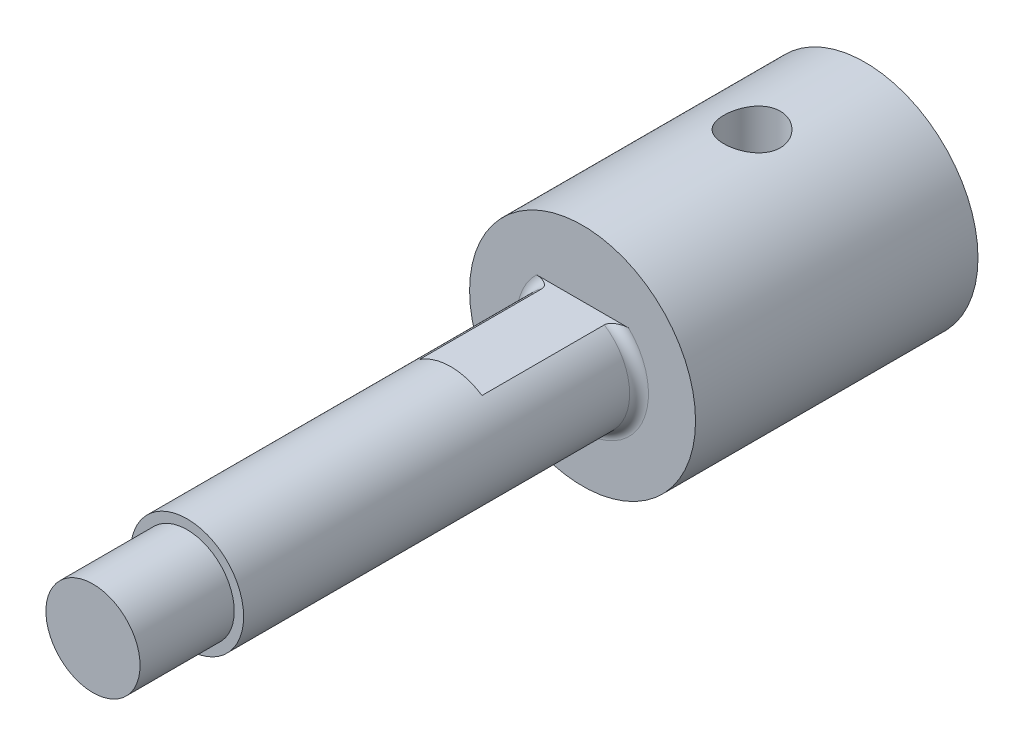
ISO-10303-21;
HEADER;
FILE_DESCRIPTION(('STEP AP214'),'2;1');
FILE_NAME('part.step','',(''),(''),'','','');
FILE_SCHEMA(('AUTOMOTIVE_DESIGN { 1 0 10303 214 1 1 1 1 }'));
ENDSEC;
DATA;
#1=APPLICATION_CONTEXT('core data for automotive mechanical design processes');
#2=APPLICATION_PROTOCOL_DEFINITION('international standard','automotive_design',2000,#1);
#3=PRODUCT_CONTEXT('',#1,'mechanical');
#4=PRODUCT('Part','Part','',(#3));
#5=PRODUCT_RELATED_PRODUCT_CATEGORY('part','',(#4));
#6=PRODUCT_DEFINITION_FORMATION('','',#4);
#7=PRODUCT_DEFINITION_CONTEXT('part definition',#1,'design');
#8=PRODUCT_DEFINITION('design','',#6,#7);
#9=PRODUCT_DEFINITION_SHAPE('','',#8);
#10=(LENGTH_UNIT() NAMED_UNIT(*) SI_UNIT(.MILLI.,.METRE.));
#11=(NAMED_UNIT(*) PLANE_ANGLE_UNIT() SI_UNIT($,.RADIAN.));
#12=(NAMED_UNIT(*) SI_UNIT($,.STERADIAN.) SOLID_ANGLE_UNIT());
#13=UNCERTAINTY_MEASURE_WITH_UNIT(LENGTH_MEASURE(1.E-05),#10,'distance_accuracy_value','');
#14=(GEOMETRIC_REPRESENTATION_CONTEXT(3) GLOBAL_UNCERTAINTY_ASSIGNED_CONTEXT((#13)) GLOBAL_UNIT_ASSIGNED_CONTEXT((#10,
#11,#12)) REPRESENTATION_CONTEXT('',''));
#15=CARTESIAN_POINT('',(0.,0.,0.));
#16=DIRECTION('',(0.,0.,1.));
#17=DIRECTION('',(1.,0.,0.));
#18=AXIS2_PLACEMENT_3D('',#15,#16,#17);
#19=CARTESIAN_POINT('',(0.,0.,11.));
#20=DIRECTION('',(0.,0.,-1.));
#21=DIRECTION('',(-1.,0.,0.));
#22=AXIS2_PLACEMENT_3D('',#19,#20,#21);
#23=CYLINDRICAL_SURFACE('',#22,6.);
#24=CARTESIAN_POINT('',(0.,0.,0.));
#25=DIRECTION('',(0.,0.,1.));
#26=DIRECTION('',(1.,0.,0.));
#27=AXIS2_PLACEMENT_3D('',#24,#25,#26);
#28=CIRCLE('',#27,6.);
#29=CARTESIAN_POINT('',(6.,0.,0.));
#30=VERTEX_POINT('',#29);
#31=EDGE_CURVE('E134',#30,#30,#28,.T.);
#32=ORIENTED_EDGE('',*,*,#31,.T.);
#33=EDGE_LOOP('',(#32));
#34=FACE_BOUND('',#33,.T.);
#35=CARTESIAN_POINT('',(0.,6.,4.5));
#36=CARTESIAN_POINT('',(-0.0828760886697311,5.99999859868013,4.50000232573816));
#37=CARTESIAN_POINT('',(-0.165778157830763,5.99826578131828,4.50689155077379));
#38=CARTESIAN_POINT('',(-0.329206323770533,5.99152113829892,4.534225151307));
#39=CARTESIAN_POINT('',(-0.409731046870739,5.98650745419968,4.55467720953785));
#40=CARTESIAN_POINT('',(-0.566020872182577,5.9737562633204,4.60843925346209));
#41=CARTESIAN_POINT('',(-0.641791563430003,5.96602202842087,4.64173379871528));
#42=CARTESIAN_POINT('',(-0.786672131904427,5.94865343807593,4.72018139004483));
#43=CARTESIAN_POINT('',(-0.855781784348759,5.9390190185405,4.76533483611894));
#44=CARTESIAN_POINT('',(-0.98680192730092,5.91867413591801,4.86720078965421));
#45=CARTESIAN_POINT('',(-1.04855569006107,5.90794707148533,4.92411157495918));
#46=CARTESIAN_POINT('',(-1.1617489272033,5.8867362011753,5.04745220490892));
#47=CARTESIAN_POINT('',(-1.21318723694913,5.87625242288348,5.1138831229465));
#48=CARTESIAN_POINT('',(-1.30502654279903,5.8565477569971,5.25559522673744));
#49=CARTESIAN_POINT('',(-1.34525221592536,5.84734794470605,5.3309932308104));
#50=CARTESIAN_POINT('',(-1.41239690855053,5.83149494812223,5.48774841165836));
#51=CARTESIAN_POINT('',(-1.43931805543933,5.82484135672789,5.56910463332576));
#52=CARTESIAN_POINT('',(-1.47855483680429,5.81500476717551,5.73374349820248));
#53=CARTESIAN_POINT('',(-1.49115226833334,5.81175491075426,5.8169548960498));
#54=CARTESIAN_POINT('',(-1.50226177506785,5.80889362537741,5.98436856901398));
#55=CARTESIAN_POINT('',(-1.50077614181798,5.80928160448644,6.06857068069861));
#56=CARTESIAN_POINT('',(-1.48398652463928,5.81359205496618,6.23341580774448));
#57=CARTESIAN_POINT('',(-1.46901834019052,5.81742863001879,6.3140956214651));
#58=CARTESIAN_POINT('',(-1.42622418690311,5.82806709676484,6.47176105091129));
#59=CARTESIAN_POINT('',(-1.39839730206942,5.83486919970697,6.54874640302899));
#60=CARTESIAN_POINT('',(-1.33038947793715,5.85075113904187,6.69773801625207));
#61=CARTESIAN_POINT('',(-1.29008666723291,5.85985327469421,6.76968617178955));
#62=CARTESIAN_POINT('',(-1.19835627601495,5.87929710846386,6.90591870975684));
#63=CARTESIAN_POINT('',(-1.14692674880884,5.88963902334735,6.97020174806726));
#64=CARTESIAN_POINT('',(-1.03266342468122,5.91075880539781,7.0912036156944));
#65=CARTESIAN_POINT('',(-0.96954625816586,5.92154069477971,7.14765449006135));
#66=CARTESIAN_POINT('',(-0.8346119175037,5.94205965578786,7.2492212424639));
#67=CARTESIAN_POINT('',(-0.762794477707944,5.95179669549415,7.29433677426357));
#68=CARTESIAN_POINT('',(-0.612115888681391,5.96917732094183,7.37205058622439));
#69=CARTESIAN_POINT('',(-0.533231393208623,5.97681360127725,7.40460534025443));
#70=CARTESIAN_POINT('',(-0.370876008142882,5.98907916991419,7.45591730570957));
#71=CARTESIAN_POINT('',(-0.287405999150484,5.99370903339281,7.47467715641814));
#72=CARTESIAN_POINT('',(-0.120539970390026,5.99935499271375,7.49745756555884));
#73=CARTESIAN_POINT('',(-0.0371967199882097,6.00046053508279,7.5018430260753));
#74=CARTESIAN_POINT('',(0.129032874801508,5.99918804814451,7.49675099794451));
#75=CARTESIAN_POINT('',(0.211919259644595,5.99681033241847,7.48727475720087));
#76=CARTESIAN_POINT('',(0.373614268776492,5.98889581127357,7.45502909160862));
#77=CARTESIAN_POINT('',(0.452465118968754,5.98340634185811,7.43245873652301));
#78=CARTESIAN_POINT('',(0.605257292452511,5.96988706634134,7.37489291597155));
#79=CARTESIAN_POINT('',(0.679198119032634,5.96185700369892,7.33989619568683));
#80=CARTESIAN_POINT('',(0.821523134429847,5.94393307926311,7.25776387112527));
#81=CARTESIAN_POINT('',(0.88978544183583,5.93400867366932,7.21042388760324));
#82=CARTESIAN_POINT('',(1.01752661364325,5.91344509187419,7.10521009120303));
#83=CARTESIAN_POINT('',(1.07700395897301,5.90280579251705,7.04733446038309));
#84=CARTESIAN_POINT('',(1.18699056807273,5.88168956960771,6.92099803915554));
#85=CARTESIAN_POINT('',(1.23724386762203,5.87122304187281,6.85231229699758));
#86=CARTESIAN_POINT('',(1.3255107590127,5.85192878377239,6.70726736553428));
#87=CARTESIAN_POINT('',(1.36352489415794,5.84310098067026,6.63090851704025));
#88=CARTESIAN_POINT('',(1.42595142060929,5.82818094734665,6.47309427758692));
#89=CARTESIAN_POINT('',(1.45044439665407,5.82207255291906,6.39167237165599));
#90=CARTESIAN_POINT('',(1.48534565995378,5.81326744090184,6.22569036211089));
#91=CARTESIAN_POINT('',(1.49575702747866,5.81056997719936,6.14113094896751));
#92=CARTESIAN_POINT('',(1.50203859033399,5.80894901203957,5.9738789761448));
#93=CARTESIAN_POINT('',(1.49831789778012,5.80991932728264,5.89120256487527));
#94=CARTESIAN_POINT('',(1.47737727831287,5.81527909007843,5.72769611133202));
#95=CARTESIAN_POINT('',(1.46015762268677,5.81966846891857,5.64686603198635));
#96=CARTESIAN_POINT('',(1.41293131944279,5.83131260682722,5.48979154093459));
#97=CARTESIAN_POINT('',(1.38300140468038,5.83855015236309,5.41352269475979));
#98=CARTESIAN_POINT('',(1.31126491360507,5.85507755724829,5.26703461728631));
#99=CARTESIAN_POINT('',(1.26945669003419,5.86436770120773,5.19681622681308));
#100=CARTESIAN_POINT('',(1.17386774863714,5.88425634263512,5.06244537099798));
#101=CARTESIAN_POINT('',(1.11980316291225,5.89488264831757,4.99849892657604));
#102=CARTESIAN_POINT('',(1.00178937118974,5.91608027246286,4.88045295520459));
#103=CARTESIAN_POINT('',(0.937837821261146,5.9266515772706,4.82635576988703));
#104=CARTESIAN_POINT('',(0.80046758670259,5.94677655647663,4.72858869143539));
#105=CARTESIAN_POINT('',(0.726898422316387,5.95630833365868,4.68512538632842));
#106=CARTESIAN_POINT('',(0.573266059510476,5.97304924975118,4.61125253705947));
#107=CARTESIAN_POINT('',(0.49320756343674,5.98026005199781,4.58083363935146));
#108=CARTESIAN_POINT('',(0.344410253243472,5.99048059565542,4.53842816967035));
#109=CARTESIAN_POINT('',(0.276380170908068,5.99402585052691,4.52404875694657));
#110=CARTESIAN_POINT('',(0.138906071536283,5.99878605231948,4.50483405637806));
#111=CARTESIAN_POINT('',(0.0694621612426163,6.00000117450894,4.4999980506947));
#112=CARTESIAN_POINT('',(0.,6.,4.5));
#113=B_SPLINE_CURVE_WITH_KNOTS('',3,(#35,#36,#37,#38,#39,#40,#41,#42,#43,#44,#45,#46,#47,#48,
#49,#50,#51,#52,#53,#54,#55,#56,#57,#58,#59,#60,#61,#62,#63,#64,#65,#66,#67,#68,#69,#70,#71,#72,
#73,#74,#75,#76,#77,#78,#79,#80,#81,#82,#83,#84,#85,#86,#87,#88,#89,#90,#91,#92,#93,#94,#95,#96,
#97,#98,#99,#100,#101,#102,#103,#104,#105,#106,#107,#108,#109,#110,#111,#112),.UNSPECIFIED.,.T.,
.F.,(4,2,2,2,2,2,2,2,2,2,2,2,2,2,2,2,2,2,2,2,2,2,2,2,2,2,2,2,2,2,2,2,2,2,2,2,2,2,4),(0.,
0.24837371247189,0.4968882377639,0.745104902286106,0.993329940169328,1.24614435437139,
1.49898729580062,1.75558647545807,2.01214461169368,2.2635629509943,2.51494038112697,
2.76022497007018,3.00552703466038,3.25330527873879,3.50112690836163,3.75601500969019,
4.01091089558247,4.26668229009114,4.52240473688643,4.77158308949276,5.02073901112743,
5.26620274514037,5.5116912732229,5.76153587565352,6.01142363008019,6.26744509204476,
6.52345518749508,6.77792254614036,7.03233423252408,7.27943780398613,7.52653640956034,
7.77216400559447,8.01782568136901,8.2698957640991,8.52202569770418,8.77872185499588,
9.0352336382135,9.24342242942149,9.4515955604304),.UNSPECIFIED.);
#114=CARTESIAN_POINT('',(0.,6.,4.5));
#115=VERTEX_POINT('',#114);
#116=EDGE_CURVE('E103',#115,#115,#113,.T.);
#117=ORIENTED_EDGE('',*,*,#116,.F.);
#118=EDGE_LOOP('',(#117));
#119=FACE_BOUND('',#118,.T.);
#120=CARTESIAN_POINT('',(0.,0.,15.));
#121=DIRECTION('',(0.,0.,1.));
#122=DIRECTION('',(1.,0.,0.));
#123=AXIS2_PLACEMENT_3D('',#120,#121,#122);
#124=CIRCLE('',#123,6.);
#125=CARTESIAN_POINT('',(6.,0.,15.));
#126=VERTEX_POINT('',#125);
#127=EDGE_CURVE('E99',#126,#126,#124,.T.);
#128=ORIENTED_EDGE('',*,*,#127,.F.);
#129=EDGE_LOOP('',(#128));
#130=FACE_BOUND('',#129,.T.);
#131=ADVANCED_FACE('F33',(#34,#119,#130),#23,.T.);
#132=CARTESIAN_POINT('',(0.,0.,11.));
#133=DIRECTION('',(0.,0.,-1.));
#134=DIRECTION('',(-1.,0.,0.));
#135=AXIS2_PLACEMENT_3D('',#132,#133,#134);
#136=CYLINDRICAL_SURFACE('',#135,3.);
#137=CARTESIAN_POINT('',(0.,0.,0.));
#138=DIRECTION('',(0.,0.,1.));
#139=DIRECTION('',(1.,0.,0.));
#140=AXIS2_PLACEMENT_3D('',#137,#138,#139);
#141=CIRCLE('',#140,3.);
#142=CARTESIAN_POINT('',(3.,0.,0.));
#143=VERTEX_POINT('',#142);
#144=EDGE_CURVE('E110',#143,#143,#141,.T.);
#145=ORIENTED_EDGE('',*,*,#144,.F.);
#146=EDGE_LOOP('',(#145));
#147=FACE_BOUND('',#146,.T.);
#148=CARTESIAN_POINT('',(0.,0.,11.));
#149=DIRECTION('',(0.,0.,1.));
#150=DIRECTION('',(1.,0.,0.));
#151=AXIS2_PLACEMENT_3D('',#148,#149,#150);
#152=CIRCLE('',#151,3.);
#153=CARTESIAN_POINT('',(3.,0.,11.));
#154=VERTEX_POINT('',#153);
#155=EDGE_CURVE('E102',#154,#154,#152,.T.);
#156=ORIENTED_EDGE('',*,*,#155,.T.);
#157=EDGE_LOOP('',(#156));
#158=FACE_BOUND('',#157,.T.);
#159=CARTESIAN_POINT('',(0.,3.,4.5));
#160=CARTESIAN_POINT('',(-0.0788579444268502,2.99999570107562,4.50000495347579));
#161=CARTESIAN_POINT('',(-0.157809899546344,2.99685736529635,4.50625510968158));
#162=CARTESIAN_POINT('',(-0.313380352903344,2.98461234055736,4.53097932051231));
#163=CARTESIAN_POINT('',(-0.389994130070444,2.97549431743379,4.54947658949672));
#164=CARTESIAN_POINT('',(-0.538400317320673,2.95224419105063,4.59779071292494));
#165=CARTESIAN_POINT('',(-0.610210204408719,2.93813158766306,4.62756357637195));
#166=CARTESIAN_POINT('',(-0.747708925209898,2.90618664773642,4.69735593204748));
#167=CARTESIAN_POINT('',(-0.813398240985088,2.88835460450288,4.7373746163733));
#168=CARTESIAN_POINT('',(-0.941261726642864,2.84934387387093,4.82927587422793));
#169=CARTESIAN_POINT('',(-1.00298281668316,2.82802798691306,4.88172971885946));
#170=CARTESIAN_POINT('',(-1.11716916730047,2.78489955370115,4.99578221887056));
#171=CARTESIAN_POINT('',(-1.16962737466015,2.76308664313552,5.05738777765866));
#172=CARTESIAN_POINT('',(-1.26787800067542,2.71948426796021,5.19372502428507));
#173=CARTESIAN_POINT('',(-1.31283800332746,2.69782780455198,5.26910414751887));
#174=CARTESIAN_POINT('',(-1.38925234033604,2.65928968158481,5.42755100397932));
#175=CARTESIAN_POINT('',(-1.4207163224495,2.64240461410484,5.51061319308412));
#176=CARTESIAN_POINT('',(-1.46719866328288,2.61686800556713,5.67699765813288));
#177=CARTESIAN_POINT('',(-1.48308878562066,2.6077840737557,5.76000667810109));
#178=CARTESIAN_POINT('',(-1.50064048996327,2.59772834922792,5.92796825666922));
#179=CARTESIAN_POINT('',(-1.50231613255961,2.59674854014932,6.01291881130673));
#180=CARTESIAN_POINT('',(-1.49203093075844,2.60266395385873,6.17142903647305));
#181=CARTESIAN_POINT('',(-1.48167683930523,2.6086314549302,6.24513604683458));
#182=CARTESIAN_POINT('',(-1.4504097735854,2.62614343100775,6.38958286405956));
#183=CARTESIAN_POINT('',(-1.42949343584648,2.63768968247664,6.46032171795797));
#184=CARTESIAN_POINT('',(-1.37731467057901,2.66531214619112,6.59884369884849));
#185=CARTESIAN_POINT('',(-1.34582260067399,2.68148760995998,6.66651959817868));
#186=CARTESIAN_POINT('',(-1.273562531502,2.71655106422106,6.79595143888501));
#187=CARTESIAN_POINT('',(-1.2327903657187,2.73544027170286,6.85770470340013));
#188=CARTESIAN_POINT('',(-1.13709908236918,2.77669736854929,6.98178187911484));
#189=CARTESIAN_POINT('',(-1.08104168755392,2.79920265355119,7.04318531036424));
#190=CARTESIAN_POINT('',(-0.95933336811206,2.84321434950611,7.15610312788635));
#191=CARTESIAN_POINT('',(-0.893677884861428,2.86472027938201,7.20761278805082));
#192=CARTESIAN_POINT('',(-0.750774758747773,2.90552980924446,7.30152849154459));
#193=CARTESIAN_POINT('',(-0.673130387399113,2.92468476243011,7.34340070866861));
#194=CARTESIAN_POINT('',(-0.510699323233195,2.95736821681863,7.41314554356451));
#195=CARTESIAN_POINT('',(-0.425918364397914,2.9709011841533,7.44102927752275));
#196=CARTESIAN_POINT('',(-0.259149737491053,2.98986500612153,7.47971310557502));
#197=CARTESIAN_POINT('',(-0.177512295822489,2.99587407451965,7.49173685362017));
#198=CARTESIAN_POINT('',(-0.0131693999240274,3.00109520188655,7.50219709670173));
#199=CARTESIAN_POINT('',(0.0695355298048631,3.00031048081978,7.5006400284592));
#200=CARTESIAN_POINT('',(0.22684945797898,2.99236788380152,7.48468996737189));
#201=CARTESIAN_POINT('',(0.301589112074895,2.98570868532253,7.47130120090501));
#202=CARTESIAN_POINT('',(0.447610338452911,2.9673325697226,7.43364289215732));
#203=CARTESIAN_POINT('',(0.51889152853663,2.95561509501618,7.40937215031976));
#204=CARTESIAN_POINT('',(0.658332912674359,2.92776377120382,7.35000230035045));
#205=CARTESIAN_POINT('',(0.726345595508705,2.91151322654446,7.31461342482557));
#206=CARTESIAN_POINT('',(0.855692042548907,2.87615961476126,7.23433869653015));
#207=CARTESIAN_POINT('',(0.917022944664887,2.85705533350407,7.18944879810691));
#208=CARTESIAN_POINT('',(1.03765153393382,2.81562332004297,7.08635936200393));
#209=CARTESIAN_POINT('',(1.09615811672854,2.79316327265249,7.02728569733228));
#210=CARTESIAN_POINT('',(1.20278448167828,2.7489358741323,6.90011227308341));
#211=CARTESIAN_POINT('',(1.25089707856781,2.72716901100071,6.83200632172812));
#212=CARTESIAN_POINT('',(1.33756187171853,2.68576788309734,6.68453451874054));
#213=CARTESIAN_POINT('',(1.37553824370037,2.66628794383591,6.60478310085828));
#214=CARTESIAN_POINT('',(1.43712423890206,2.63361108441202,6.43873489863755));
#215=CARTESIAN_POINT('',(1.46075237380052,2.62040607332625,6.35244671029967));
#216=CARTESIAN_POINT('',(1.49079253120031,2.60342251538703,6.18463466567294));
#217=CARTESIAN_POINT('',(1.49863949460818,2.59886075197597,6.10344861984714));
#218=CARTESIAN_POINT('',(1.5010337315643,2.59748031962405,5.94082939925321));
#219=CARTESIAN_POINT('',(1.49558676993486,2.60065829439585,5.85939634689321));
#220=CARTESIAN_POINT('',(1.47288918838996,2.61356793076615,5.70677474769984));
#221=CARTESIAN_POINT('',(1.45681247151455,2.62264641723988,5.63534929478289));
#222=CARTESIAN_POINT('',(1.41476303733662,2.64556524281479,5.49628782086345));
#223=CARTESIAN_POINT('',(1.38878713673988,2.65940711354503,5.42865302686195));
#224=CARTESIAN_POINT('',(1.32572361795085,2.69142795546804,5.2940627235202));
#225=CARTESIAN_POINT('',(1.28800670672355,2.70983583593881,5.22745814725646));
#226=CARTESIAN_POINT('',(1.20322645745609,2.74852997452291,5.10108819572811));
#227=CARTESIAN_POINT('',(1.15615825686234,2.76881720693416,5.04132640421833));
#228=CARTESIAN_POINT('',(1.04730498999206,2.81193484737138,4.92278702646799));
#229=CARTESIAN_POINT('',(0.984426634495892,2.83477474959942,4.86501134647456));
#230=CARTESIAN_POINT('',(0.849232209349796,2.87816628389896,4.7606055248471));
#231=CARTESIAN_POINT('',(0.776911084957796,2.89871667939293,4.71398139079514));
#232=CARTESIAN_POINT('',(0.623897395174419,2.93547014349806,4.6331454559319));
#233=CARTESIAN_POINT('',(0.543149255665096,2.95164144740899,4.5990237461453));
#234=CARTESIAN_POINT('',(0.37611315170713,2.9775201194848,4.54528774836389));
#235=CARTESIAN_POINT('',(0.28984169938365,2.98724585044602,4.52563222979143));
#236=CARTESIAN_POINT('',(0.168902919736342,2.99543192870217,4.50915388337139));
#237=CARTESIAN_POINT('',(0.135242819162347,2.99714048010376,4.50572603870049));
#238=CARTESIAN_POINT('',(0.0677275977076368,2.99942545465223,4.50114800172887));
#239=CARTESIAN_POINT('',(0.0338724714699424,3.00000184655071,4.49999787229469));
#240=CARTESIAN_POINT('',(0.,3.,4.5));
#241=B_SPLINE_CURVE_WITH_KNOTS('',3,(#159,#160,#161,#162,#163,#164,#165,#166,#167,#168,#169,
#170,#171,#172,#173,#174,#175,#176,#177,#178,#179,#180,#181,#182,#183,#184,#185,#186,#187,#188,
#189,#190,#191,#192,#193,#194,#195,#196,#197,#198,#199,#200,#201,#202,#203,#204,#205,#206,#207,
#208,#209,#210,#211,#212,#213,#214,#215,#216,#217,#218,#219,#220,#221,#222,#223,#224,#225,#226,
#227,#228,#229,#230,#231,#232,#233,#234,#235,#236,#237,#238,#239,#240),.UNSPECIFIED.,.T.,.F.,(4,
2,2,2,2,2,2,2,2,2,2,2,2,2,2,2,2,2,2,2,2,2,2,2,2,2,2,2,2,2,2,2,2,2,2,2,2,2,2,2,4),(0.,
0.236436386130439,0.473322224563796,0.709293233238447,0.945245640872351,1.19547263807713,
1.44588935648105,1.71572589646129,1.98536921847421,2.23887018210344,2.49212035993531,
2.71508568613981,2.93812205888518,3.16635360252731,3.39468781890333,3.65197412000818,
3.9093830189803,4.17874533321661,4.44789325368419,4.69474935707019,4.94148846767214,
5.16910359759183,5.39674382446397,5.63089284041848,5.86514176122509,6.12239415966628,
6.37982382923148,6.64972023242589,6.91926767918176,7.1629396125457,7.40650589797018,
7.62686895373284,7.84730293182527,8.08254685170431,8.31791341715446,8.58187864135757,
8.84598575071869,9.1119602049529,9.37717362931724,9.47872920200875,9.58028757766599),.UNSPECIFIED.);
#242=CARTESIAN_POINT('',(0.,3.,4.5));
#243=VERTEX_POINT('',#242);
#244=EDGE_CURVE('E111',#243,#243,#241,.T.);
#245=ORIENTED_EDGE('',*,*,#244,.T.);
#246=EDGE_LOOP('',(#245));
#247=FACE_BOUND('',#246,.T.);
#248=ADVANCED_FACE('F124',(#147,#158,#247),#136,.F.);
#249=CARTESIAN_POINT('',(0.,0.,0.));
#250=DIRECTION('',(0.,0.,1.));
#251=DIRECTION('',(1.,0.,0.));
#252=AXIS2_PLACEMENT_3D('',#249,#250,#251);
#253=PLANE('',#252);
#254=ORIENTED_EDGE('',*,*,#31,.F.);
#255=EDGE_LOOP('',(#254));
#256=FACE_BOUND('',#255,.T.);
#257=ORIENTED_EDGE('',*,*,#144,.T.);
#258=EDGE_LOOP('',(#257));
#259=FACE_BOUND('',#258,.T.);
#260=ADVANCED_FACE('F121',(#256,#259),#253,.F.);
#261=CARTESIAN_POINT('',(0.,6.,6.));
#262=DIRECTION('',(0.,-1.,0.));
#263=DIRECTION('',(0.,0.,-1.));
#264=AXIS2_PLACEMENT_3D('',#261,#262,#263);
#265=CYLINDRICAL_SURFACE('',#264,1.5);
#266=ORIENTED_EDGE('',*,*,#244,.F.);
#267=EDGE_LOOP('',(#266));
#268=FACE_BOUND('',#267,.T.);
#269=ORIENTED_EDGE('',*,*,#116,.T.);
#270=EDGE_LOOP('',(#269));
#271=FACE_BOUND('',#270,.T.);
#272=ADVANCED_FACE('F115',(#268,#271),#265,.F.);
#273=CARTESIAN_POINT('',(0.,0.,11.));
#274=DIRECTION('',(0.,0.,1.));
#275=DIRECTION('',(1.,0.,0.));
#276=AXIS2_PLACEMENT_3D('',#273,#274,#275);
#277=PLANE('',#276);
#278=ORIENTED_EDGE('',*,*,#155,.F.);
#279=EDGE_LOOP('',(#278));
#280=FACE_BOUND('',#279,.T.);
#281=ADVANCED_FACE('F120',(#280),#277,.F.);
#282=CARTESIAN_POINT('',(0.,0.,15.));
#283=DIRECTION('',(0.,0.,1.));
#284=DIRECTION('',(1.,0.,0.));
#285=AXIS2_PLACEMENT_3D('',#282,#283,#284);
#286=PLANE('',#285);
#287=DIRECTION('',(-1.,0.,0.));
#288=VECTOR('',#287,1.);
#289=CARTESIAN_POINT('',(-1.6583123951777,2.5,15.));
#290=LINE('',#289,#288);
#291=CARTESIAN_POINT('',(2.44948974278318,2.5,15.));
#292=VERTEX_POINT('',#291);
#293=CARTESIAN_POINT('',(-2.44948974278318,2.5,15.));
#294=VERTEX_POINT('',#293);
#295=EDGE_CURVE('E53',#292,#294,#290,.T.);
#296=ORIENTED_EDGE('',*,*,#295,.F.);
#297=CARTESIAN_POINT('',(0.,0.,15.));
#298=DIRECTION('',(0.,0.,1.));
#299=DIRECTION('',(1.,0.,0.));
#300=AXIS2_PLACEMENT_3D('',#297,#298,#299);
#301=CIRCLE('',#300,3.5);
#302=EDGE_CURVE('E137',#292,#294,#301,.F.);
#303=ORIENTED_EDGE('',*,*,#302,.T.);
#304=EDGE_LOOP('',(#296,#303));
#305=FACE_BOUND('',#304,.T.);
#306=ORIENTED_EDGE('',*,*,#127,.T.);
#307=EDGE_LOOP('',(#306));
#308=FACE_BOUND('',#307,.T.);
#309=ADVANCED_FACE('F150',(#305,#308),#286,.T.);
#310=CARTESIAN_POINT('',(0.,0.,22.));
#311=DIRECTION('',(0.,0.,-1.));
#312=DIRECTION('',(-1.,0.,0.));
#313=AXIS2_PLACEMENT_3D('',#310,#311,#312);
#314=CYLINDRICAL_SURFACE('',#313,3.);
#315=DIRECTION('',(0.,0.,-1.));
#316=VECTOR('',#315,1.);
#317=CARTESIAN_POINT('',(-1.6583123951777,2.5,22.));
#318=LINE('',#317,#316);
#319=CARTESIAN_POINT('',(-1.6583123951777,2.5,22.));
#320=VERTEX_POINT('',#319);
#321=CARTESIAN_POINT('',(-1.6583123951777,2.5,15.5));
#322=VERTEX_POINT('',#321);
#323=EDGE_CURVE('E68',#320,#322,#318,.T.);
#324=ORIENTED_EDGE('',*,*,#323,.T.);
#325=CARTESIAN_POINT('',(0.,0.,15.5));
#326=DIRECTION('',(0.,0.,1.));
#327=DIRECTION('',(1.,0.,0.));
#328=AXIS2_PLACEMENT_3D('',#325,#326,#327);
#329=CIRCLE('',#328,3.);
#330=CARTESIAN_POINT('',(1.6583123951777,2.5,15.5));
#331=VERTEX_POINT('',#330);
#332=EDGE_CURVE('E135',#322,#331,#329,.T.);
#333=ORIENTED_EDGE('',*,*,#332,.T.);
#334=DIRECTION('',(0.,0.,-1.));
#335=VECTOR('',#334,1.);
#336=CARTESIAN_POINT('',(1.6583123951777,2.5,22.));
#337=LINE('',#336,#335);
#338=CARTESIAN_POINT('',(1.6583123951777,2.5,22.));
#339=VERTEX_POINT('',#338);
#340=EDGE_CURVE('E79',#339,#331,#337,.T.);
#341=ORIENTED_EDGE('',*,*,#340,.F.);
#342=CARTESIAN_POINT('',(0.,0.,22.));
#343=DIRECTION('',(0.,0.,1.));
#344=DIRECTION('',(1.,0.,0.));
#345=AXIS2_PLACEMENT_3D('',#342,#343,#344);
#346=CIRCLE('',#345,3.);
#347=EDGE_CURVE('E84',#339,#320,#346,.T.);
#348=ORIENTED_EDGE('',*,*,#347,.T.);
#349=EDGE_LOOP('',(#324,#333,#341,#348));
#350=FACE_BOUND('',#349,.T.);
#351=CARTESIAN_POINT('',(0.,0.,36.));
#352=DIRECTION('',(0.,0.,1.));
#353=DIRECTION('',(1.,0.,0.));
#354=AXIS2_PLACEMENT_3D('',#351,#352,#353);
#355=CIRCLE('',#354,3.);
#356=CARTESIAN_POINT('',(3.,0.,36.));
#357=VERTEX_POINT('',#356);
#358=EDGE_CURVE('E88',#357,#357,#355,.T.);
#359=ORIENTED_EDGE('',*,*,#358,.F.);
#360=EDGE_LOOP('',(#359));
#361=FACE_BOUND('',#360,.T.);
#362=ADVANCED_FACE('F86',(#350,#361),#314,.T.);
#363=CARTESIAN_POINT('',(-1.6583123951777,2.5,22.));
#364=DIRECTION('',(0.,-1.,0.));
#365=DIRECTION('',(0.,0.,-1.));
#366=AXIS2_PLACEMENT_3D('',#363,#364,#365);
#367=PLANE('',#366);
#368=ORIENTED_EDGE('',*,*,#295,.T.);
#369=CARTESIAN_POINT('',(-2.44948974278318,2.5,15.));
#370=CARTESIAN_POINT('',(-2.41940937969566,2.5,15.0000073866066));
#371=CARTESIAN_POINT('',(-2.38933812617588,2.5,15.0013295913752));
#372=CARTESIAN_POINT('',(-2.329405756924,2.5,15.0065052497232));
#373=CARTESIAN_POINT('',(-2.29954469376654,2.5,15.010359315339));
#374=CARTESIAN_POINT('',(-2.23994670218816,2.5,15.0205502523936));
#375=CARTESIAN_POINT('',(-2.21021390772889,2.5,15.0269112529315));
#376=CARTESIAN_POINT('',(-2.15138680763895,2.5,15.0420713077403));
#377=CARTESIAN_POINT('',(-2.12229235465099,2.5,15.0508697928039));
#378=CARTESIAN_POINT('',(-2.04943130519185,2.5,15.0763409508637));
#379=CARTESIAN_POINT('',(-2.00624048071723,2.5,15.0946986050865));
#380=CARTESIAN_POINT('',(-1.92312365269565,2.5,15.1375621848111));
#381=CARTESIAN_POINT('',(-1.88318558865063,2.5,15.1620438858609));
#382=CARTESIAN_POINT('',(-1.8250739498636,2.5,15.2057568677343));
#383=CARTESIAN_POINT('',(-1.80506520076453,2.5,15.2225474951));
#384=CARTESIAN_POINT('',(-1.76739437438787,2.5,15.2586310721064));
#385=CARTESIAN_POINT('',(-1.74973119025652,2.5,15.2779228329268));
#386=CARTESIAN_POINT('',(-1.72147338968679,2.5,15.3145110280826));
#387=CARTESIAN_POINT('',(-1.71018446111508,2.5,15.3312657016726));
#388=CARTESIAN_POINT('',(-1.6904187695173,2.5,15.36631246309));
#389=CARTESIAN_POINT('',(-1.68193047429613,2.5,15.3845978474645));
#390=CARTESIAN_POINT('',(-1.66981615690512,2.5,15.4189201003085));
#391=CARTESIAN_POINT('',(-1.66557747748921,2.5,15.4347373677232));
#392=CARTESIAN_POINT('',(-1.6597912915942,2.5,15.4670159001187));
#393=CARTESIAN_POINT('',(-1.65827166260654,2.5,15.4834820866881));
#394=CARTESIAN_POINT('',(-1.65831239517765,2.5,15.5));
#395=B_SPLINE_CURVE_WITH_KNOTS('',3,(#369,#370,#371,#372,#373,#374,#375,#376,#377,#378,#379,
#380,#381,#382,#383,#384,#385,#386,#387,#388,#389,#390,#391,#392,#393,#394),.UNSPECIFIED.,.F.,
.F.,(4,2,2,2,2,2,2,2,2,2,2,2,4),(0.,0.090199273192427,0.18042035863049,0.271531898314787,
0.362622179318715,0.502981504742298,0.642794165600374,0.720993411089287,0.799155622830584,
0.859567910033007,0.919728238726894,0.968630046550295,1.01803041575854),.UNSPECIFIED.);
#396=EDGE_CURVE('E11',#294,#322,#395,.T.);
#397=ORIENTED_EDGE('',*,*,#396,.T.);
#398=ORIENTED_EDGE('',*,*,#323,.F.);
#399=DIRECTION('',(-1.,0.,0.));
#400=VECTOR('',#399,1.);
#401=CARTESIAN_POINT('',(-1.6583123951777,2.5,22.));
#402=LINE('',#401,#400);
#403=EDGE_CURVE('E72',#339,#320,#402,.T.);
#404=ORIENTED_EDGE('',*,*,#403,.F.);
#405=ORIENTED_EDGE('',*,*,#340,.T.);
#406=CARTESIAN_POINT('',(1.6583123951777,2.5,15.5));
#407=CARTESIAN_POINT('',(1.65826958745856,2.5,15.4832213078112));
#408=CARTESIAN_POINT('',(1.65983829970382,2.5,15.4664984277411));
#409=CARTESIAN_POINT('',(1.66580165493053,2.5,15.4337452121763));
#410=CARTESIAN_POINT('',(1.67016519590625,2.5,15.4177093018613));
#411=CARTESIAN_POINT('',(1.68272638248585,2.5,15.3826463154428));
#412=CARTESIAN_POINT('',(1.69160795664844,2.5,15.363868021749));
#413=CARTESIAN_POINT('',(1.71228820885712,2.5,15.3279323282251));
#414=CARTESIAN_POINT('',(1.72410042769408,2.5,15.3107829782816));
#415=CARTESIAN_POINT('',(1.75681630725953,2.5,15.2693724976088));
#416=CARTESIAN_POINT('',(1.77918337397481,2.5,15.2462765131802));
#417=CARTESIAN_POINT('',(1.82710073421058,2.5,15.2037123752433));
#418=CARTESIAN_POINT('',(1.85265774178293,2.5,15.1842520963488));
#419=CARTESIAN_POINT('',(1.92239931233264,2.5,15.1374586089614));
#420=CARTESIAN_POINT('',(1.96831862997673,2.5,15.1127125315982));
#421=CARTESIAN_POINT('',(2.06338149462692,2.5,15.0705610996304));
#422=CARTESIAN_POINT('',(2.11253021699457,2.5,15.0531678772457));
#423=CARTESIAN_POINT('',(2.2094612943265,2.5,15.0264149542185));
#424=CARTESIAN_POINT('',(2.25711644583142,2.5,15.0165971475356));
#425=CARTESIAN_POINT('',(2.3290904786241,2.5,15.0066981398535));
#426=CARTESIAN_POINT('',(2.35309750555045,2.5,15.0042033795534));
#427=CARTESIAN_POINT('',(2.40122919521556,2.5,15.000855740903));
#428=CARTESIAN_POINT('',(2.42535387678982,2.5,15.0000031347169));
#429=CARTESIAN_POINT('',(2.44948974278318,2.5,15.));
#430=B_SPLINE_CURVE_WITH_KNOTS('',3,(#406,#407,#408,#409,#410,#411,#412,#413,#414,#415,#416,
#417,#418,#419,#420,#421,#422,#423,#424,#425,#426,#427,#428,#429),.UNSPECIFIED.,.F.,.F.,(4,2,2,
2,2,2,2,2,2,2,2,4),(0.,0.0501726247748694,0.0997963860424634,0.161769905959326,
0.224035283126053,0.319949910806574,0.416069931818868,0.571712268081149,0.72761042140894,
0.873119698229761,0.945480317675527,1.01785292885535),.UNSPECIFIED.);
#431=EDGE_CURVE('E47',#331,#292,#430,.T.);
#432=ORIENTED_EDGE('',*,*,#431,.T.);
#433=EDGE_LOOP('',(#368,#397,#398,#404,#405,#432));
#434=FACE_BOUND('',#433,.T.);
#435=ADVANCED_FACE('F70',(#434),#367,.F.);
#436=CARTESIAN_POINT('',(0.,0.,22.));
#437=DIRECTION('',(0.,0.,1.));
#438=DIRECTION('',(1.,0.,0.));
#439=AXIS2_PLACEMENT_3D('',#436,#437,#438);
#440=PLANE('',#439);
#441=ORIENTED_EDGE('',*,*,#347,.F.);
#442=ORIENTED_EDGE('',*,*,#403,.T.);
#443=EDGE_LOOP('',(#441,#442));
#444=FACE_BOUND('',#443,.T.);
#445=ADVANCED_FACE('F83',(#444),#440,.F.);
#446=CARTESIAN_POINT('',(0.,0.,36.));
#447=DIRECTION('',(0.,0.,1.));
#448=DIRECTION('',(1.,0.,0.));
#449=AXIS2_PLACEMENT_3D('',#446,#447,#448);
#450=PLANE('',#449);
#451=CARTESIAN_POINT('',(0.,0.,36.));
#452=DIRECTION('',(0.,0.,1.));
#453=DIRECTION('',(1.,0.,0.));
#454=AXIS2_PLACEMENT_3D('',#451,#452,#453);
#455=CIRCLE('',#454,2.5);
#456=CARTESIAN_POINT('',(2.5,0.,36.));
#457=VERTEX_POINT('',#456);
#458=EDGE_CURVE('E138',#457,#457,#455,.T.);
#459=ORIENTED_EDGE('',*,*,#458,.F.);
#460=EDGE_LOOP('',(#459));
#461=FACE_BOUND('',#460,.T.);
#462=ORIENTED_EDGE('',*,*,#358,.T.);
#463=EDGE_LOOP('',(#462));
#464=FACE_BOUND('',#463,.T.);
#465=ADVANCED_FACE('F205',(#461,#464),#450,.T.);
#466=CARTESIAN_POINT('',(0.,0.,41.));
#467=DIRECTION('',(0.,0.,-1.));
#468=DIRECTION('',(-1.,0.,0.));
#469=AXIS2_PLACEMENT_3D('',#466,#467,#468);
#470=CYLINDRICAL_SURFACE('',#469,2.5);
#471=CARTESIAN_POINT('',(0.,0.,41.));
#472=DIRECTION('',(0.,0.,1.));
#473=DIRECTION('',(1.,0.,0.));
#474=AXIS2_PLACEMENT_3D('',#471,#472,#473);
#475=CIRCLE('',#474,2.5);
#476=CARTESIAN_POINT('',(2.5,0.,41.));
#477=VERTEX_POINT('',#476);
#478=EDGE_CURVE('E89',#477,#477,#475,.T.);
#479=ORIENTED_EDGE('',*,*,#478,.F.);
#480=EDGE_LOOP('',(#479));
#481=FACE_BOUND('',#480,.T.);
#482=ORIENTED_EDGE('',*,*,#458,.T.);
#483=EDGE_LOOP('',(#482));
#484=FACE_BOUND('',#483,.T.);
#485=ADVANCED_FACE('F214',(#481,#484),#470,.T.);
#486=CARTESIAN_POINT('',(0.,0.,41.));
#487=DIRECTION('',(0.,0.,1.));
#488=DIRECTION('',(1.,0.,0.));
#489=AXIS2_PLACEMENT_3D('',#486,#487,#488);
#490=PLANE('',#489);
#491=ORIENTED_EDGE('',*,*,#478,.T.);
#492=EDGE_LOOP('',(#491));
#493=FACE_BOUND('',#492,.T.);
#494=ADVANCED_FACE('F223',(#493),#490,.T.);
#495=CARTESIAN_POINT('',(0.,0.,15.5));
#496=DIRECTION('',(0.,0.,1.));
#497=DIRECTION('',(1.,0.,0.));
#498=AXIS2_PLACEMENT_3D('',#495,#496,#497);
#499=TOROIDAL_SURFACE('',#498,3.5,0.5);
#500=ORIENTED_EDGE('',*,*,#396,.F.);
#501=ORIENTED_EDGE('',*,*,#302,.F.);
#502=ORIENTED_EDGE('',*,*,#431,.F.);
#503=ORIENTED_EDGE('',*,*,#332,.F.);
#504=EDGE_LOOP('',(#500,#501,#502,#503));
#505=FACE_BOUND('',#504,.T.);
#506=ADVANCED_FACE('F35',(#505),#499,.F.);
#507=CLOSED_SHELL('',(#131,#248,#260,#272,#281,#309,#362,#435,#445,#465,#485,#494,#506));
#508=MANIFOLD_SOLID_BREP('B2',#507);
#509=ADVANCED_BREP_SHAPE_REPRESENTATION('',(#18,#508),#14);
#510=SHAPE_DEFINITION_REPRESENTATION(#9,#509);
ENDSEC;
END-ISO-10303-21;
